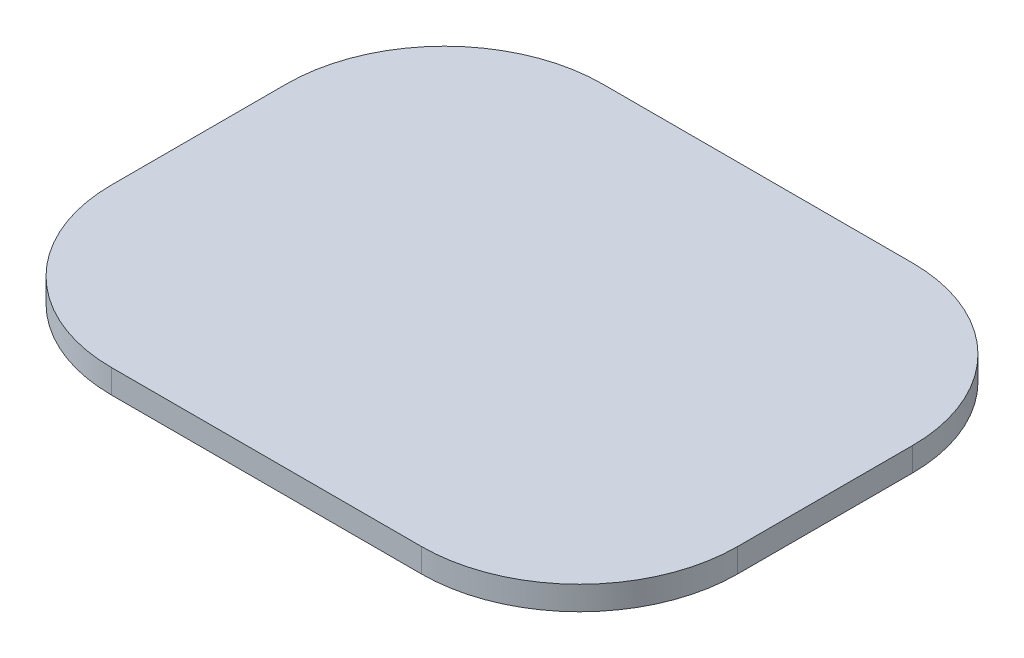
ISO-10303-21;
HEADER;
FILE_DESCRIPTION(('STEP AP214'),'2;1');
FILE_NAME('part.step','',(''),(''),'','','');
FILE_SCHEMA(('AUTOMOTIVE_DESIGN { 1 0 10303 214 1 1 1 1 }'));
ENDSEC;
DATA;
#1=APPLICATION_CONTEXT('core data for automotive mechanical design processes');
#2=APPLICATION_PROTOCOL_DEFINITION('international standard','automotive_design',2000,#1);
#3=PRODUCT_CONTEXT('',#1,'mechanical');
#4=PRODUCT('Part','Part','',(#3));
#5=PRODUCT_RELATED_PRODUCT_CATEGORY('part','',(#4));
#6=PRODUCT_DEFINITION_FORMATION('','',#4);
#7=PRODUCT_DEFINITION_CONTEXT('part definition',#1,'design');
#8=PRODUCT_DEFINITION('design','',#6,#7);
#9=PRODUCT_DEFINITION_SHAPE('','',#8);
#10=(LENGTH_UNIT() NAMED_UNIT(*) SI_UNIT(.MILLI.,.METRE.));
#11=(NAMED_UNIT(*) PLANE_ANGLE_UNIT() SI_UNIT($,.RADIAN.));
#12=(NAMED_UNIT(*) SI_UNIT($,.STERADIAN.) SOLID_ANGLE_UNIT());
#13=UNCERTAINTY_MEASURE_WITH_UNIT(LENGTH_MEASURE(1.E-05),#10,'distance_accuracy_value','');
#14=(GEOMETRIC_REPRESENTATION_CONTEXT(3) GLOBAL_UNCERTAINTY_ASSIGNED_CONTEXT((#13)) GLOBAL_UNIT_ASSIGNED_CONTEXT((#10,
#11,#12)) REPRESENTATION_CONTEXT('',''));
#15=CARTESIAN_POINT('',(0.,0.,0.));
#16=DIRECTION('',(0.,0.,1.));
#17=DIRECTION('',(1.,0.,0.));
#18=AXIS2_PLACEMENT_3D('',#15,#16,#17);
#19=CARTESIAN_POINT('',(-19.5,1.5,-11.));
#20=DIRECTION('',(0.,-1.,0.));
#21=DIRECTION('',(0.,0.,-1.));
#22=AXIS2_PLACEMENT_3D('',#19,#20,#21);
#23=CYLINDRICAL_SURFACE('',#22,19.9);
#24=CARTESIAN_POINT('',(-19.5,-1.5,-11.));
#25=DIRECTION('',(0.,1.,0.));
#26=DIRECTION('',(0.,0.,1.));
#27=AXIS2_PLACEMENT_3D('',#24,#25,#26);
#28=CIRCLE('',#27,19.9);
#29=CARTESIAN_POINT('',(-19.5,-1.5,-30.9));
#30=VERTEX_POINT('',#29);
#31=CARTESIAN_POINT('',(-39.4,-1.5,-11.));
#32=VERTEX_POINT('',#31);
#33=EDGE_CURVE('E137',#30,#32,#28,.T.);
#34=ORIENTED_EDGE('',*,*,#33,.T.);
#35=DIRECTION('',(0.,-1.,0.));
#36=VECTOR('',#35,1.);
#37=CARTESIAN_POINT('',(-39.4,1.5,-11.));
#38=LINE('',#37,#36);
#39=CARTESIAN_POINT('',(-39.4,1.5,-11.));
#40=VERTEX_POINT('',#39);
#41=EDGE_CURVE('E11',#40,#32,#38,.T.);
#42=ORIENTED_EDGE('',*,*,#41,.F.);
#43=CARTESIAN_POINT('',(-19.5,1.5,-11.));
#44=DIRECTION('',(0.,1.,0.));
#45=DIRECTION('',(0.,0.,1.));
#46=AXIS2_PLACEMENT_3D('',#43,#44,#45);
#47=CIRCLE('',#46,19.9);
#48=CARTESIAN_POINT('',(-19.5,1.5,-30.9));
#49=VERTEX_POINT('',#48);
#50=EDGE_CURVE('E151',#49,#40,#47,.T.);
#51=ORIENTED_EDGE('',*,*,#50,.F.);
#52=DIRECTION('',(0.,-1.,0.));
#53=VECTOR('',#52,1.);
#54=CARTESIAN_POINT('',(-19.5,1.5,-30.9));
#55=LINE('',#54,#53);
#56=EDGE_CURVE('E133',#49,#30,#55,.T.);
#57=ORIENTED_EDGE('',*,*,#56,.T.);
#58=EDGE_LOOP('',(#34,#42,#51,#57));
#59=FACE_BOUND('',#58,.T.);
#60=ADVANCED_FACE('F41',(#59),#23,.T.);
#61=CARTESIAN_POINT('',(-39.4,1.5,-11.));
#62=DIRECTION('',(1.,0.,0.));
#63=DIRECTION('',(0.,0.,-1.));
#64=AXIS2_PLACEMENT_3D('',#61,#62,#63);
#65=PLANE('',#64);
#66=DIRECTION('',(0.,0.,1.));
#67=VECTOR('',#66,1.);
#68=CARTESIAN_POINT('',(-39.4,-1.5,-11.));
#69=LINE('',#68,#67);
#70=CARTESIAN_POINT('',(-39.4,-1.5,11.));
#71=VERTEX_POINT('',#70);
#72=EDGE_CURVE('E140',#32,#71,#69,.T.);
#73=ORIENTED_EDGE('',*,*,#72,.T.);
#74=DIRECTION('',(0.,-1.,0.));
#75=VECTOR('',#74,1.);
#76=CARTESIAN_POINT('',(-39.4,1.5,11.));
#77=LINE('',#76,#75);
#78=CARTESIAN_POINT('',(-39.4,1.5,11.));
#79=VERTEX_POINT('',#78);
#80=EDGE_CURVE('E49',#79,#71,#77,.T.);
#81=ORIENTED_EDGE('',*,*,#80,.F.);
#82=DIRECTION('',(0.,0.,1.));
#83=VECTOR('',#82,1.);
#84=CARTESIAN_POINT('',(-39.4,1.5,-11.));
#85=LINE('',#84,#83);
#86=EDGE_CURVE('E100',#40,#79,#85,.T.);
#87=ORIENTED_EDGE('',*,*,#86,.F.);
#88=ORIENTED_EDGE('',*,*,#41,.T.);
#89=EDGE_LOOP('',(#73,#81,#87,#88));
#90=FACE_BOUND('',#89,.T.);
#91=ADVANCED_FACE('F186',(#90),#65,.F.);
#92=CARTESIAN_POINT('',(-19.5,1.5,11.));
#93=DIRECTION('',(0.,-1.,0.));
#94=DIRECTION('',(0.,0.,-1.));
#95=AXIS2_PLACEMENT_3D('',#92,#93,#94);
#96=CYLINDRICAL_SURFACE('',#95,19.9);
#97=CARTESIAN_POINT('',(-19.5,-1.5,11.));
#98=DIRECTION('',(0.,1.,0.));
#99=DIRECTION('',(0.,0.,1.));
#100=AXIS2_PLACEMENT_3D('',#97,#98,#99);
#101=CIRCLE('',#100,19.9);
#102=CARTESIAN_POINT('',(-19.5,-1.5,30.9));
#103=VERTEX_POINT('',#102);
#104=EDGE_CURVE('E142',#71,#103,#101,.T.);
#105=ORIENTED_EDGE('',*,*,#104,.T.);
#106=DIRECTION('',(0.,-1.,0.));
#107=VECTOR('',#106,1.);
#108=CARTESIAN_POINT('',(-19.5,1.5,30.9));
#109=LINE('',#108,#107);
#110=CARTESIAN_POINT('',(-19.5,1.5,30.9));
#111=VERTEX_POINT('',#110);
#112=EDGE_CURVE('E158',#111,#103,#109,.T.);
#113=ORIENTED_EDGE('',*,*,#112,.F.);
#114=CARTESIAN_POINT('',(-19.5,1.5,11.));
#115=DIRECTION('',(0.,1.,0.));
#116=DIRECTION('',(0.,0.,1.));
#117=AXIS2_PLACEMENT_3D('',#114,#115,#116);
#118=CIRCLE('',#117,19.9);
#119=EDGE_CURVE('E166',#79,#111,#118,.T.);
#120=ORIENTED_EDGE('',*,*,#119,.F.);
#121=ORIENTED_EDGE('',*,*,#80,.T.);
#122=EDGE_LOOP('',(#105,#113,#120,#121));
#123=FACE_BOUND('',#122,.T.);
#124=ADVANCED_FACE('F164',(#123),#96,.T.);
#125=CARTESIAN_POINT('',(-19.5,1.5,30.9));
#126=DIRECTION('',(0.,0.,-1.));
#127=DIRECTION('',(-1.,0.,0.));
#128=AXIS2_PLACEMENT_3D('',#125,#126,#127);
#129=PLANE('',#128);
#130=DIRECTION('',(1.,0.,0.));
#131=VECTOR('',#130,1.);
#132=CARTESIAN_POINT('',(-19.5,-1.5,30.9));
#133=LINE('',#132,#131);
#134=CARTESIAN_POINT('',(19.5,-1.5,30.9));
#135=VERTEX_POINT('',#134);
#136=EDGE_CURVE('E144',#103,#135,#133,.T.);
#137=ORIENTED_EDGE('',*,*,#136,.T.);
#138=DIRECTION('',(0.,-1.,0.));
#139=VECTOR('',#138,1.);
#140=CARTESIAN_POINT('',(19.5,1.5,30.9));
#141=LINE('',#140,#139);
#142=CARTESIAN_POINT('',(19.5,1.5,30.9));
#143=VERTEX_POINT('',#142);
#144=EDGE_CURVE('E155',#143,#135,#141,.T.);
#145=ORIENTED_EDGE('',*,*,#144,.F.);
#146=DIRECTION('',(1.,0.,0.));
#147=VECTOR('',#146,1.);
#148=CARTESIAN_POINT('',(-19.5,1.5,30.9));
#149=LINE('',#148,#147);
#150=EDGE_CURVE('E178',#111,#143,#149,.T.);
#151=ORIENTED_EDGE('',*,*,#150,.F.);
#152=ORIENTED_EDGE('',*,*,#112,.T.);
#153=EDGE_LOOP('',(#137,#145,#151,#152));
#154=FACE_BOUND('',#153,.T.);
#155=ADVANCED_FACE('F174',(#154),#129,.F.);
#156=CARTESIAN_POINT('',(19.5,1.5,11.));
#157=DIRECTION('',(0.,-1.,0.));
#158=DIRECTION('',(0.,0.,-1.));
#159=AXIS2_PLACEMENT_3D('',#156,#157,#158);
#160=CYLINDRICAL_SURFACE('',#159,19.9);
#161=CARTESIAN_POINT('',(19.5,-1.5,11.));
#162=DIRECTION('',(0.,1.,0.));
#163=DIRECTION('',(0.,0.,1.));
#164=AXIS2_PLACEMENT_3D('',#161,#162,#163);
#165=CIRCLE('',#164,19.9);
#166=CARTESIAN_POINT('',(39.4,-1.5,11.));
#167=VERTEX_POINT('',#166);
#168=EDGE_CURVE('E146',#135,#167,#165,.T.);
#169=ORIENTED_EDGE('',*,*,#168,.T.);
#170=DIRECTION('',(0.,-1.,0.));
#171=VECTOR('',#170,1.);
#172=CARTESIAN_POINT('',(39.4,1.5,11.));
#173=LINE('',#172,#171);
#174=CARTESIAN_POINT('',(39.4,1.5,11.));
#175=VERTEX_POINT('',#174);
#176=EDGE_CURVE('E128',#175,#167,#173,.T.);
#177=ORIENTED_EDGE('',*,*,#176,.F.);
#178=CARTESIAN_POINT('',(19.5,1.5,11.));
#179=DIRECTION('',(0.,1.,0.));
#180=DIRECTION('',(0.,0.,1.));
#181=AXIS2_PLACEMENT_3D('',#178,#179,#180);
#182=CIRCLE('',#181,19.9);
#183=EDGE_CURVE('E119',#143,#175,#182,.T.);
#184=ORIENTED_EDGE('',*,*,#183,.F.);
#185=ORIENTED_EDGE('',*,*,#144,.T.);
#186=EDGE_LOOP('',(#169,#177,#184,#185));
#187=FACE_BOUND('',#186,.T.);
#188=ADVANCED_FACE('F177',(#187),#160,.T.);
#189=CARTESIAN_POINT('',(39.4,1.5,-11.));
#190=DIRECTION('',(-1.,0.,0.));
#191=DIRECTION('',(0.,0.,1.));
#192=AXIS2_PLACEMENT_3D('',#189,#190,#191);
#193=PLANE('',#192);
#194=DIRECTION('',(0.,0.,-1.));
#195=VECTOR('',#194,1.);
#196=CARTESIAN_POINT('',(39.4,-1.5,-11.));
#197=LINE('',#196,#195);
#198=CARTESIAN_POINT('',(39.4,-1.5,-11.));
#199=VERTEX_POINT('',#198);
#200=EDGE_CURVE('E127',#167,#199,#197,.T.);
#201=ORIENTED_EDGE('',*,*,#200,.T.);
#202=DIRECTION('',(0.,-1.,0.));
#203=VECTOR('',#202,1.);
#204=CARTESIAN_POINT('',(39.4,1.5,-11.));
#205=LINE('',#204,#203);
#206=CARTESIAN_POINT('',(39.4,1.5,-11.));
#207=VERTEX_POINT('',#206);
#208=EDGE_CURVE('E124',#207,#199,#205,.T.);
#209=ORIENTED_EDGE('',*,*,#208,.F.);
#210=DIRECTION('',(0.,0.,-1.));
#211=VECTOR('',#210,1.);
#212=CARTESIAN_POINT('',(39.4,1.5,-11.));
#213=LINE('',#212,#211);
#214=EDGE_CURVE('E113',#175,#207,#213,.T.);
#215=ORIENTED_EDGE('',*,*,#214,.F.);
#216=ORIENTED_EDGE('',*,*,#176,.T.);
#217=EDGE_LOOP('',(#201,#209,#215,#216));
#218=FACE_BOUND('',#217,.T.);
#219=ADVANCED_FACE('F125',(#218),#193,.F.);
#220=CARTESIAN_POINT('',(19.5,1.5,-11.));
#221=DIRECTION('',(0.,-1.,0.));
#222=DIRECTION('',(0.,0.,-1.));
#223=AXIS2_PLACEMENT_3D('',#220,#221,#222);
#224=CYLINDRICAL_SURFACE('',#223,19.9);
#225=CARTESIAN_POINT('',(19.5,-1.5,-11.));
#226=DIRECTION('',(0.,1.,0.));
#227=DIRECTION('',(0.,0.,-1.));
#228=AXIS2_PLACEMENT_3D('',#225,#226,#227);
#229=CIRCLE('',#228,19.9);
#230=CARTESIAN_POINT('',(19.5,-1.5,-30.9));
#231=VERTEX_POINT('',#230);
#232=EDGE_CURVE('E86',#199,#231,#229,.T.);
#233=ORIENTED_EDGE('',*,*,#232,.T.);
#234=DIRECTION('',(0.,-1.,0.));
#235=VECTOR('',#234,1.);
#236=CARTESIAN_POINT('',(19.5,1.5,-30.9));
#237=LINE('',#236,#235);
#238=CARTESIAN_POINT('',(19.5,1.5,-30.9));
#239=VERTEX_POINT('',#238);
#240=EDGE_CURVE('E129',#239,#231,#237,.T.);
#241=ORIENTED_EDGE('',*,*,#240,.F.);
#242=CARTESIAN_POINT('',(19.5,1.5,-11.));
#243=DIRECTION('',(0.,1.,0.));
#244=DIRECTION('',(0.,0.,-1.));
#245=AXIS2_PLACEMENT_3D('',#242,#243,#244);
#246=CIRCLE('',#245,19.9);
#247=EDGE_CURVE('E117',#207,#239,#246,.T.);
#248=ORIENTED_EDGE('',*,*,#247,.F.);
#249=ORIENTED_EDGE('',*,*,#208,.T.);
#250=EDGE_LOOP('',(#233,#241,#248,#249));
#251=FACE_BOUND('',#250,.T.);
#252=ADVANCED_FACE('F131',(#251),#224,.T.);
#253=CARTESIAN_POINT('',(-19.5,1.5,-30.9));
#254=DIRECTION('',(0.,0.,1.));
#255=DIRECTION('',(1.,0.,0.));
#256=AXIS2_PLACEMENT_3D('',#253,#254,#255);
#257=PLANE('',#256);
#258=DIRECTION('',(-1.,0.,0.));
#259=VECTOR('',#258,1.);
#260=CARTESIAN_POINT('',(-19.5,-1.5,-30.9));
#261=LINE('',#260,#259);
#262=EDGE_CURVE('E92',#231,#30,#261,.T.);
#263=ORIENTED_EDGE('',*,*,#262,.T.);
#264=ORIENTED_EDGE('',*,*,#56,.F.);
#265=DIRECTION('',(-1.,0.,0.));
#266=VECTOR('',#265,1.);
#267=CARTESIAN_POINT('',(-19.5,1.5,-30.9));
#268=LINE('',#267,#266);
#269=EDGE_CURVE('E57',#239,#49,#268,.T.);
#270=ORIENTED_EDGE('',*,*,#269,.F.);
#271=ORIENTED_EDGE('',*,*,#240,.T.);
#272=EDGE_LOOP('',(#263,#264,#270,#271));
#273=FACE_BOUND('',#272,.T.);
#274=ADVANCED_FACE('F202',(#273),#257,.F.);
#275=CARTESIAN_POINT('',(-19.5,1.5,-11.));
#276=DIRECTION('',(0.,1.,0.));
#277=DIRECTION('',(0.,0.,1.));
#278=AXIS2_PLACEMENT_3D('',#275,#276,#277);
#279=PLANE('',#278);
#280=ORIENTED_EDGE('',*,*,#50,.T.);
#281=ORIENTED_EDGE('',*,*,#86,.T.);
#282=ORIENTED_EDGE('',*,*,#119,.T.);
#283=ORIENTED_EDGE('',*,*,#150,.T.);
#284=ORIENTED_EDGE('',*,*,#183,.T.);
#285=ORIENTED_EDGE('',*,*,#214,.T.);
#286=ORIENTED_EDGE('',*,*,#247,.T.);
#287=ORIENTED_EDGE('',*,*,#269,.T.);
#288=EDGE_LOOP('',(#280,#281,#282,#283,#284,#285,#286,#287));
#289=FACE_BOUND('',#288,.T.);
#290=ADVANCED_FACE('F115',(#289),#279,.T.);
#291=CARTESIAN_POINT('',(-19.5,-1.5,-11.));
#292=DIRECTION('',(0.,1.,0.));
#293=DIRECTION('',(0.,0.,1.));
#294=AXIS2_PLACEMENT_3D('',#291,#292,#293);
#295=PLANE('',#294);
#296=ORIENTED_EDGE('',*,*,#33,.F.);
#297=ORIENTED_EDGE('',*,*,#262,.F.);
#298=ORIENTED_EDGE('',*,*,#232,.F.);
#299=ORIENTED_EDGE('',*,*,#200,.F.);
#300=ORIENTED_EDGE('',*,*,#168,.F.);
#301=ORIENTED_EDGE('',*,*,#136,.F.);
#302=ORIENTED_EDGE('',*,*,#104,.F.);
#303=ORIENTED_EDGE('',*,*,#72,.F.);
#304=EDGE_LOOP('',(#296,#297,#298,#299,#300,#301,#302,#303));
#305=FACE_BOUND('',#304,.T.);
#306=ADVANCED_FACE('F170',(#305),#295,.F.);
#307=CLOSED_SHELL('',(#60,#91,#124,#155,#188,#219,#252,#274,#290,#306));
#308=MANIFOLD_SOLID_BREP('B2',#307);
#309=ADVANCED_BREP_SHAPE_REPRESENTATION('',(#18,#308),#14);
#310=SHAPE_DEFINITION_REPRESENTATION(#9,#309);
ENDSEC;
END-ISO-10303-21;
